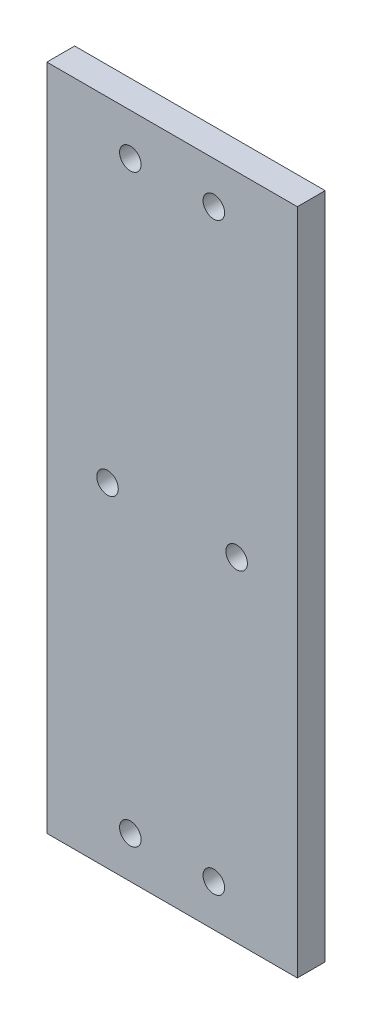
ISO-10303-21;
HEADER;
FILE_DESCRIPTION(('STEP AP214'),'2;1');
FILE_NAME('part.step','',(''),(''),'','','');
FILE_SCHEMA(('AUTOMOTIVE_DESIGN { 1 0 10303 214 1 1 1 1 }'));
ENDSEC;
DATA;
#1=APPLICATION_CONTEXT('core data for automotive mechanical design processes');
#2=APPLICATION_PROTOCOL_DEFINITION('international standard','automotive_design',2000,#1);
#3=PRODUCT_CONTEXT('',#1,'mechanical');
#4=PRODUCT('Part','Part','',(#3));
#5=PRODUCT_RELATED_PRODUCT_CATEGORY('part','',(#4));
#6=PRODUCT_DEFINITION_FORMATION('','',#4);
#7=PRODUCT_DEFINITION_CONTEXT('part definition',#1,'design');
#8=PRODUCT_DEFINITION('design','',#6,#7);
#9=PRODUCT_DEFINITION_SHAPE('','',#8);
#10=(LENGTH_UNIT() NAMED_UNIT(*) SI_UNIT(.MILLI.,.METRE.));
#11=(NAMED_UNIT(*) PLANE_ANGLE_UNIT() SI_UNIT($,.RADIAN.));
#12=(NAMED_UNIT(*) SI_UNIT($,.STERADIAN.) SOLID_ANGLE_UNIT());
#13=UNCERTAINTY_MEASURE_WITH_UNIT(LENGTH_MEASURE(1.E-05),#10,'distance_accuracy_value','');
#14=(GEOMETRIC_REPRESENTATION_CONTEXT(3) GLOBAL_UNCERTAINTY_ASSIGNED_CONTEXT((#13)) GLOBAL_UNIT_ASSIGNED_CONTEXT((#10,
#11,#12)) REPRESENTATION_CONTEXT('',''));
#15=CARTESIAN_POINT('',(0.,0.,0.));
#16=DIRECTION('',(0.,0.,1.));
#17=DIRECTION('',(1.,0.,0.));
#18=AXIS2_PLACEMENT_3D('',#15,#16,#17);
#19=CARTESIAN_POINT('',(0.,0.,6.35));
#20=DIRECTION('',(1.,0.,0.));
#21=DIRECTION('',(0.,0.,-1.));
#22=AXIS2_PLACEMENT_3D('',#19,#20,#21);
#23=PLANE('',#22);
#24=DIRECTION('',(0.,-1.,0.));
#25=VECTOR('',#24,1.);
#26=CARTESIAN_POINT('',(0.,0.,0.));
#27=LINE('',#26,#25);
#28=CARTESIAN_POINT('',(0.,152.4,0.));
#29=VERTEX_POINT('',#28);
#30=CARTESIAN_POINT('',(0.,0.,0.));
#31=VERTEX_POINT('',#30);
#32=EDGE_CURVE('E103',#29,#31,#27,.T.);
#33=ORIENTED_EDGE('',*,*,#32,.T.);
#34=DIRECTION('',(0.,0.,-1.));
#35=VECTOR('',#34,1.);
#36=CARTESIAN_POINT('',(0.,0.,6.35));
#37=LINE('',#36,#35);
#38=CARTESIAN_POINT('',(0.,0.,6.35));
#39=VERTEX_POINT('',#38);
#40=EDGE_CURVE('E11',#39,#31,#37,.T.);
#41=ORIENTED_EDGE('',*,*,#40,.F.);
#42=DIRECTION('',(0.,-1.,0.));
#43=VECTOR('',#42,1.);
#44=CARTESIAN_POINT('',(0.,0.,6.35));
#45=LINE('',#44,#43);
#46=CARTESIAN_POINT('',(0.,152.4,6.35));
#47=VERTEX_POINT('',#46);
#48=EDGE_CURVE('E90',#47,#39,#45,.T.);
#49=ORIENTED_EDGE('',*,*,#48,.F.);
#50=DIRECTION('',(0.,0.,-1.));
#51=VECTOR('',#50,1.);
#52=CARTESIAN_POINT('',(0.,152.4,6.35));
#53=LINE('',#52,#51);
#54=EDGE_CURVE('E99',#47,#29,#53,.T.);
#55=ORIENTED_EDGE('',*,*,#54,.T.);
#56=EDGE_LOOP('',(#33,#41,#49,#55));
#57=FACE_BOUND('',#56,.T.);
#58=ADVANCED_FACE('F37',(#57),#23,.F.);
#59=CARTESIAN_POINT('',(0.,0.,6.35));
#60=DIRECTION('',(0.,1.,0.));
#61=DIRECTION('',(0.,0.,1.));
#62=AXIS2_PLACEMENT_3D('',#59,#60,#61);
#63=PLANE('',#62);
#64=DIRECTION('',(1.,0.,0.));
#65=VECTOR('',#64,1.);
#66=CARTESIAN_POINT('',(0.,0.,0.));
#67=LINE('',#66,#65);
#68=CARTESIAN_POINT('',(57.15,0.,0.));
#69=VERTEX_POINT('',#68);
#70=EDGE_CURVE('E94',#31,#69,#67,.T.);
#71=ORIENTED_EDGE('',*,*,#70,.T.);
#72=DIRECTION('',(0.,0.,-1.));
#73=VECTOR('',#72,1.);
#74=CARTESIAN_POINT('',(57.15,0.,6.35));
#75=LINE('',#74,#73);
#76=CARTESIAN_POINT('',(57.15,0.,6.35));
#77=VERTEX_POINT('',#76);
#78=EDGE_CURVE('E46',#77,#69,#75,.T.);
#79=ORIENTED_EDGE('',*,*,#78,.F.);
#80=DIRECTION('',(1.,0.,0.));
#81=VECTOR('',#80,1.);
#82=CARTESIAN_POINT('',(0.,0.,6.35));
#83=LINE('',#82,#81);
#84=EDGE_CURVE('E85',#39,#77,#83,.T.);
#85=ORIENTED_EDGE('',*,*,#84,.F.);
#86=ORIENTED_EDGE('',*,*,#40,.T.);
#87=EDGE_LOOP('',(#71,#79,#85,#86));
#88=FACE_BOUND('',#87,.T.);
#89=ADVANCED_FACE('F93',(#88),#63,.F.);
#90=CARTESIAN_POINT('',(57.15,0.,6.35));
#91=DIRECTION('',(-1.,0.,0.));
#92=DIRECTION('',(0.,0.,1.));
#93=AXIS2_PLACEMENT_3D('',#90,#91,#92);
#94=PLANE('',#93);
#95=DIRECTION('',(0.,1.,0.));
#96=VECTOR('',#95,1.);
#97=CARTESIAN_POINT('',(57.15,0.,0.));
#98=LINE('',#97,#96);
#99=CARTESIAN_POINT('',(57.15,152.4,0.));
#100=VERTEX_POINT('',#99);
#101=EDGE_CURVE('E72',#69,#100,#98,.T.);
#102=ORIENTED_EDGE('',*,*,#101,.T.);
#103=DIRECTION('',(0.,0.,-1.));
#104=VECTOR('',#103,1.);
#105=CARTESIAN_POINT('',(57.15,152.4,6.35));
#106=LINE('',#105,#104);
#107=CARTESIAN_POINT('',(57.15,152.4,6.35));
#108=VERTEX_POINT('',#107);
#109=EDGE_CURVE('E95',#108,#100,#106,.T.);
#110=ORIENTED_EDGE('',*,*,#109,.F.);
#111=DIRECTION('',(0.,1.,0.));
#112=VECTOR('',#111,1.);
#113=CARTESIAN_POINT('',(57.15,0.,6.35));
#114=LINE('',#113,#112);
#115=EDGE_CURVE('E88',#77,#108,#114,.T.);
#116=ORIENTED_EDGE('',*,*,#115,.F.);
#117=ORIENTED_EDGE('',*,*,#78,.T.);
#118=EDGE_LOOP('',(#102,#110,#116,#117));
#119=FACE_BOUND('',#118,.T.);
#120=ADVANCED_FACE('F97',(#119),#94,.F.);
#121=CARTESIAN_POINT('',(0.,152.4,6.35));
#122=DIRECTION('',(0.,-1.,0.));
#123=DIRECTION('',(0.,0.,-1.));
#124=AXIS2_PLACEMENT_3D('',#121,#122,#123);
#125=PLANE('',#124);
#126=DIRECTION('',(-1.,0.,0.));
#127=VECTOR('',#126,1.);
#128=CARTESIAN_POINT('',(0.,152.4,0.));
#129=LINE('',#128,#127);
#130=EDGE_CURVE('E78',#100,#29,#129,.T.);
#131=ORIENTED_EDGE('',*,*,#130,.T.);
#132=ORIENTED_EDGE('',*,*,#54,.F.);
#133=DIRECTION('',(-1.,0.,0.));
#134=VECTOR('',#133,1.);
#135=CARTESIAN_POINT('',(0.,152.4,6.35));
#136=LINE('',#135,#134);
#137=EDGE_CURVE('E55',#108,#47,#136,.T.);
#138=ORIENTED_EDGE('',*,*,#137,.F.);
#139=ORIENTED_EDGE('',*,*,#109,.T.);
#140=EDGE_LOOP('',(#131,#132,#138,#139));
#141=FACE_BOUND('',#140,.T.);
#142=ADVANCED_FACE('F169',(#141),#125,.F.);
#143=CARTESIAN_POINT('',(0.,0.,6.35));
#144=DIRECTION('',(0.,0.,-1.));
#145=DIRECTION('',(-1.,0.,0.));
#146=AXIS2_PLACEMENT_3D('',#143,#144,#145);
#147=PLANE('',#146);
#148=CARTESIAN_POINT('',(19.05,9.525,6.35));
#149=DIRECTION('',(0.,0.,1.));
#150=DIRECTION('',(1.,0.,0.));
#151=AXIS2_PLACEMENT_3D('',#148,#149,#150);
#152=CIRCLE('',#151,2.45744999999999);
#153=CARTESIAN_POINT('',(21.50745,9.525,6.35));
#154=VERTEX_POINT('',#153);
#155=EDGE_CURVE('E144',#154,#154,#152,.T.);
#156=ORIENTED_EDGE('',*,*,#155,.F.);
#157=EDGE_LOOP('',(#156));
#158=FACE_BOUND('',#157,.T.);
#159=CARTESIAN_POINT('',(38.1,9.525,6.35));
#160=DIRECTION('',(0.,0.,1.));
#161=DIRECTION('',(1.,0.,0.));
#162=AXIS2_PLACEMENT_3D('',#159,#160,#161);
#163=CIRCLE('',#162,2.45744999999999);
#164=CARTESIAN_POINT('',(40.55745,9.525,6.35));
#165=VERTEX_POINT('',#164);
#166=EDGE_CURVE('E141',#165,#165,#163,.T.);
#167=ORIENTED_EDGE('',*,*,#166,.F.);
#168=EDGE_LOOP('',(#167));
#169=FACE_BOUND('',#168,.T.);
#170=CARTESIAN_POINT('',(19.05,142.875,6.35));
#171=DIRECTION('',(0.,0.,1.));
#172=DIRECTION('',(1.,0.,0.));
#173=AXIS2_PLACEMENT_3D('',#170,#171,#172);
#174=CIRCLE('',#173,2.45744999999999);
#175=CARTESIAN_POINT('',(21.50745,142.875,6.35));
#176=VERTEX_POINT('',#175);
#177=EDGE_CURVE('E135',#176,#176,#174,.T.);
#178=ORIENTED_EDGE('',*,*,#177,.F.);
#179=EDGE_LOOP('',(#178));
#180=FACE_BOUND('',#179,.T.);
#181=CARTESIAN_POINT('',(38.1,142.875,6.35));
#182=DIRECTION('',(0.,0.,1.));
#183=DIRECTION('',(1.,0.,0.));
#184=AXIS2_PLACEMENT_3D('',#181,#182,#183);
#185=CIRCLE('',#184,2.45744999999999);
#186=CARTESIAN_POINT('',(40.55745,142.875,6.35));
#187=VERTEX_POINT('',#186);
#188=EDGE_CURVE('E129',#187,#187,#185,.T.);
#189=ORIENTED_EDGE('',*,*,#188,.F.);
#190=EDGE_LOOP('',(#189));
#191=FACE_BOUND('',#190,.T.);
#192=CARTESIAN_POINT('',(13.843,76.2,6.35));
#193=DIRECTION('',(0.,0.,1.));
#194=DIRECTION('',(1.,0.,0.));
#195=AXIS2_PLACEMENT_3D('',#192,#193,#194);
#196=CIRCLE('',#195,2.45744999999999);
#197=CARTESIAN_POINT('',(16.30045,76.2,6.35));
#198=VERTEX_POINT('',#197);
#199=EDGE_CURVE('E121',#198,#198,#196,.T.);
#200=ORIENTED_EDGE('',*,*,#199,.F.);
#201=EDGE_LOOP('',(#200));
#202=FACE_BOUND('',#201,.T.);
#203=CARTESIAN_POINT('',(43.307,76.2,6.35));
#204=DIRECTION('',(0.,0.,1.));
#205=DIRECTION('',(1.,0.,0.));
#206=AXIS2_PLACEMENT_3D('',#203,#204,#205);
#207=CIRCLE('',#206,2.45744999999999);
#208=CARTESIAN_POINT('',(45.76445,76.2,6.35));
#209=VERTEX_POINT('',#208);
#210=EDGE_CURVE('E112',#209,#209,#207,.T.);
#211=ORIENTED_EDGE('',*,*,#210,.F.);
#212=EDGE_LOOP('',(#211));
#213=FACE_BOUND('',#212,.T.);
#214=ORIENTED_EDGE('',*,*,#48,.T.);
#215=ORIENTED_EDGE('',*,*,#84,.T.);
#216=ORIENTED_EDGE('',*,*,#115,.T.);
#217=ORIENTED_EDGE('',*,*,#137,.T.);
#218=EDGE_LOOP('',(#214,#215,#216,#217));
#219=FACE_BOUND('',#218,.T.);
#220=ADVANCED_FACE('F86',(#158,#169,#180,#191,#202,#213,#219),#147,.F.);
#221=CARTESIAN_POINT('',(0.,0.,0.));
#222=DIRECTION('',(0.,0.,-1.));
#223=DIRECTION('',(-1.,0.,0.));
#224=AXIS2_PLACEMENT_3D('',#221,#222,#223);
#225=PLANE('',#224);
#226=CARTESIAN_POINT('',(19.05,9.525,0.));
#227=DIRECTION('',(0.,0.,-1.));
#228=DIRECTION('',(-1.,0.,0.));
#229=AXIS2_PLACEMENT_3D('',#226,#227,#228);
#230=CIRCLE('',#229,2.45744999999999);
#231=CARTESIAN_POINT('',(16.59255,9.525,0.));
#232=VERTEX_POINT('',#231);
#233=EDGE_CURVE('E40',#232,#232,#230,.T.);
#234=ORIENTED_EDGE('',*,*,#233,.F.);
#235=EDGE_LOOP('',(#234));
#236=FACE_BOUND('',#235,.T.);
#237=CARTESIAN_POINT('',(38.1,9.525,0.));
#238=DIRECTION('',(0.,0.,-1.));
#239=DIRECTION('',(-1.,0.,0.));
#240=AXIS2_PLACEMENT_3D('',#237,#238,#239);
#241=CIRCLE('',#240,2.45745);
#242=CARTESIAN_POINT('',(35.64255,9.525,0.));
#243=VERTEX_POINT('',#242);
#244=EDGE_CURVE('E138',#243,#243,#241,.T.);
#245=ORIENTED_EDGE('',*,*,#244,.F.);
#246=EDGE_LOOP('',(#245));
#247=FACE_BOUND('',#246,.T.);
#248=CARTESIAN_POINT('',(19.05,142.875,0.));
#249=DIRECTION('',(0.,0.,-1.));
#250=DIRECTION('',(-1.,0.,0.));
#251=AXIS2_PLACEMENT_3D('',#248,#249,#250);
#252=CIRCLE('',#251,2.45744999999999);
#253=CARTESIAN_POINT('',(16.59255,142.875,0.));
#254=VERTEX_POINT('',#253);
#255=EDGE_CURVE('E132',#254,#254,#252,.T.);
#256=ORIENTED_EDGE('',*,*,#255,.F.);
#257=EDGE_LOOP('',(#256));
#258=FACE_BOUND('',#257,.T.);
#259=CARTESIAN_POINT('',(38.1,142.875,0.));
#260=DIRECTION('',(0.,0.,-1.));
#261=DIRECTION('',(-1.,0.,0.));
#262=AXIS2_PLACEMENT_3D('',#259,#260,#261);
#263=CIRCLE('',#262,2.45745);
#264=CARTESIAN_POINT('',(35.64255,142.875,0.));
#265=VERTEX_POINT('',#264);
#266=EDGE_CURVE('E126',#265,#265,#263,.T.);
#267=ORIENTED_EDGE('',*,*,#266,.F.);
#268=EDGE_LOOP('',(#267));
#269=FACE_BOUND('',#268,.T.);
#270=CARTESIAN_POINT('',(13.843,76.2,0.));
#271=DIRECTION('',(0.,0.,-1.));
#272=DIRECTION('',(-1.,0.,0.));
#273=AXIS2_PLACEMENT_3D('',#270,#271,#272);
#274=CIRCLE('',#273,2.45744999999999);
#275=CARTESIAN_POINT('',(11.38555,76.2,0.));
#276=VERTEX_POINT('',#275);
#277=EDGE_CURVE('E116',#276,#276,#274,.T.);
#278=ORIENTED_EDGE('',*,*,#277,.F.);
#279=EDGE_LOOP('',(#278));
#280=FACE_BOUND('',#279,.T.);
#281=CARTESIAN_POINT('',(43.307,76.2,0.));
#282=DIRECTION('',(0.,0.,-1.));
#283=DIRECTION('',(-1.,0.,0.));
#284=AXIS2_PLACEMENT_3D('',#281,#282,#283);
#285=CIRCLE('',#284,2.45744999999999);
#286=CARTESIAN_POINT('',(40.84955,76.2,0.));
#287=VERTEX_POINT('',#286);
#288=EDGE_CURVE('E106',#287,#287,#285,.T.);
#289=ORIENTED_EDGE('',*,*,#288,.F.);
#290=EDGE_LOOP('',(#289));
#291=FACE_BOUND('',#290,.T.);
#292=ORIENTED_EDGE('',*,*,#32,.F.);
#293=ORIENTED_EDGE('',*,*,#130,.F.);
#294=ORIENTED_EDGE('',*,*,#101,.F.);
#295=ORIENTED_EDGE('',*,*,#70,.F.);
#296=EDGE_LOOP('',(#292,#293,#294,#295));
#297=FACE_BOUND('',#296,.T.);
#298=ADVANCED_FACE('F153',(#236,#247,#258,#269,#280,#291,#297),#225,.T.);
#299=CARTESIAN_POINT('',(43.307,76.2,6.35));
#300=DIRECTION('',(0.,0.,1.));
#301=DIRECTION('',(1.,0.,0.));
#302=AXIS2_PLACEMENT_3D('',#299,#300,#301);
#303=CYLINDRICAL_SURFACE('',#302,2.45744999999999);
#304=ORIENTED_EDGE('',*,*,#288,.T.);
#305=EDGE_LOOP('',(#304));
#306=FACE_BOUND('',#305,.T.);
#307=ORIENTED_EDGE('',*,*,#210,.T.);
#308=EDGE_LOOP('',(#307));
#309=FACE_BOUND('',#308,.T.);
#310=ADVANCED_FACE('F156',(#306,#309),#303,.F.);
#311=CARTESIAN_POINT('',(13.843,76.2,6.35));
#312=DIRECTION('',(0.,0.,1.));
#313=DIRECTION('',(1.,0.,0.));
#314=AXIS2_PLACEMENT_3D('',#311,#312,#313);
#315=CYLINDRICAL_SURFACE('',#314,2.45744999999999);
#316=ORIENTED_EDGE('',*,*,#277,.T.);
#317=EDGE_LOOP('',(#316));
#318=FACE_BOUND('',#317,.T.);
#319=ORIENTED_EDGE('',*,*,#199,.T.);
#320=EDGE_LOOP('',(#319));
#321=FACE_BOUND('',#320,.T.);
#322=ADVANCED_FACE('F206',(#318,#321),#315,.F.);
#323=CARTESIAN_POINT('',(38.1,142.875,6.35));
#324=DIRECTION('',(0.,0.,1.));
#325=DIRECTION('',(1.,0.,0.));
#326=AXIS2_PLACEMENT_3D('',#323,#324,#325);
#327=CYLINDRICAL_SURFACE('',#326,2.45745);
#328=ORIENTED_EDGE('',*,*,#266,.T.);
#329=EDGE_LOOP('',(#328));
#330=FACE_BOUND('',#329,.T.);
#331=ORIENTED_EDGE('',*,*,#188,.T.);
#332=EDGE_LOOP('',(#331));
#333=FACE_BOUND('',#332,.T.);
#334=ADVANCED_FACE('F213',(#330,#333),#327,.F.);
#335=CARTESIAN_POINT('',(19.05,142.875,6.35));
#336=DIRECTION('',(0.,0.,1.));
#337=DIRECTION('',(1.,0.,0.));
#338=AXIS2_PLACEMENT_3D('',#335,#336,#337);
#339=CYLINDRICAL_SURFACE('',#338,2.45744999999999);
#340=ORIENTED_EDGE('',*,*,#255,.T.);
#341=EDGE_LOOP('',(#340));
#342=FACE_BOUND('',#341,.T.);
#343=ORIENTED_EDGE('',*,*,#177,.T.);
#344=EDGE_LOOP('',(#343));
#345=FACE_BOUND('',#344,.T.);
#346=ADVANCED_FACE('F221',(#342,#345),#339,.F.);
#347=CARTESIAN_POINT('',(38.1,9.525,6.35));
#348=DIRECTION('',(0.,0.,1.));
#349=DIRECTION('',(1.,0.,0.));
#350=AXIS2_PLACEMENT_3D('',#347,#348,#349);
#351=CYLINDRICAL_SURFACE('',#350,2.45745);
#352=ORIENTED_EDGE('',*,*,#244,.T.);
#353=EDGE_LOOP('',(#352));
#354=FACE_BOUND('',#353,.T.);
#355=ORIENTED_EDGE('',*,*,#166,.T.);
#356=EDGE_LOOP('',(#355));
#357=FACE_BOUND('',#356,.T.);
#358=ADVANCED_FACE('F229',(#354,#357),#351,.F.);
#359=CARTESIAN_POINT('',(19.05,9.525,6.35));
#360=DIRECTION('',(0.,0.,1.));
#361=DIRECTION('',(1.,0.,0.));
#362=AXIS2_PLACEMENT_3D('',#359,#360,#361);
#363=CYLINDRICAL_SURFACE('',#362,2.45744999999999);
#364=ORIENTED_EDGE('',*,*,#233,.T.);
#365=EDGE_LOOP('',(#364));
#366=FACE_BOUND('',#365,.T.);
#367=ORIENTED_EDGE('',*,*,#155,.T.);
#368=EDGE_LOOP('',(#367));
#369=FACE_BOUND('',#368,.T.);
#370=ADVANCED_FACE('F151',(#366,#369),#363,.F.);
#371=CLOSED_SHELL('',(#58,#89,#120,#142,#220,#298,#310,#322,#334,#346,#358,#370));
#372=MANIFOLD_SOLID_BREP('B2',#371);
#373=ADVANCED_BREP_SHAPE_REPRESENTATION('',(#18,#372),#14);
#374=SHAPE_DEFINITION_REPRESENTATION(#9,#373);
ENDSEC;
END-ISO-10303-21;
